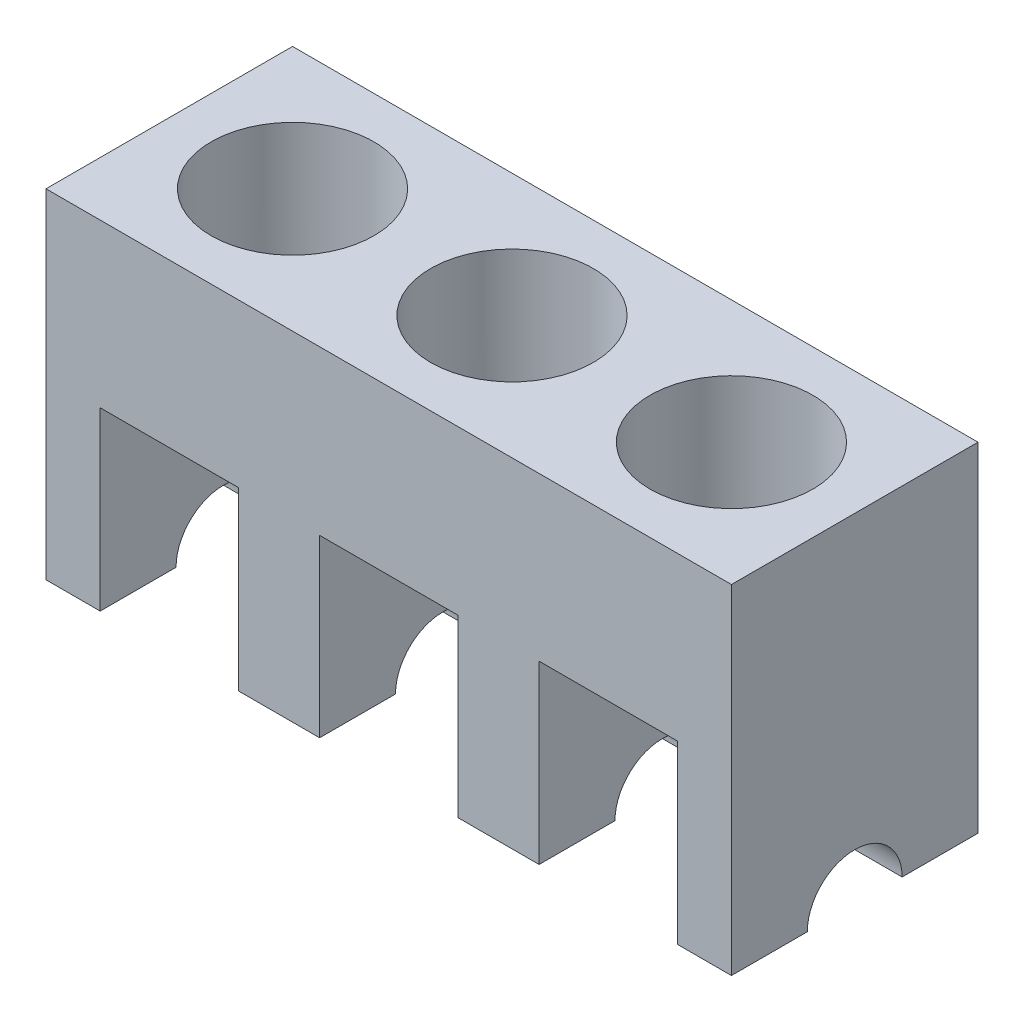
ISO-10303-21;
HEADER;
FILE_DESCRIPTION(('STEP AP214'),'2;1');
FILE_NAME('part.step','',(''),(''),'','','');
FILE_SCHEMA(('AUTOMOTIVE_DESIGN { 1 0 10303 214 1 1 1 1 }'));
ENDSEC;
DATA;
#1=APPLICATION_CONTEXT('core data for automotive mechanical design processes');
#2=APPLICATION_PROTOCOL_DEFINITION('international standard','automotive_design',2000,#1);
#3=PRODUCT_CONTEXT('',#1,'mechanical');
#4=PRODUCT('Part','Part','',(#3));
#5=PRODUCT_RELATED_PRODUCT_CATEGORY('part','',(#4));
#6=PRODUCT_DEFINITION_FORMATION('','',#4);
#7=PRODUCT_DEFINITION_CONTEXT('part definition',#1,'design');
#8=PRODUCT_DEFINITION('design','',#6,#7);
#9=PRODUCT_DEFINITION_SHAPE('','',#8);
#10=(LENGTH_UNIT() NAMED_UNIT(*) SI_UNIT(.MILLI.,.METRE.));
#11=(NAMED_UNIT(*) PLANE_ANGLE_UNIT() SI_UNIT($,.RADIAN.));
#12=(NAMED_UNIT(*) SI_UNIT($,.STERADIAN.) SOLID_ANGLE_UNIT());
#13=UNCERTAINTY_MEASURE_WITH_UNIT(LENGTH_MEASURE(1.E-05),#10,'distance_accuracy_value','');
#14=(GEOMETRIC_REPRESENTATION_CONTEXT(3) GLOBAL_UNCERTAINTY_ASSIGNED_CONTEXT((#13)) GLOBAL_UNIT_ASSIGNED_CONTEXT((#10,
#11,#12)) REPRESENTATION_CONTEXT('',''));
#15=CARTESIAN_POINT('',(0.,0.,0.));
#16=DIRECTION('',(0.,0.,1.));
#17=DIRECTION('',(1.,0.,0.));
#18=AXIS2_PLACEMENT_3D('',#15,#16,#17);
#19=CARTESIAN_POINT('',(0.,0.,0.));
#20=DIRECTION('',(0.,1.,0.));
#21=DIRECTION('',(0.,0.,1.));
#22=AXIS2_PLACEMENT_3D('',#19,#20,#21);
#23=PLANE('',#22);
#24=DIRECTION('',(0.,0.,1.));
#25=VECTOR('',#24,1.);
#26=CARTESIAN_POINT('',(-2.23538704581357,0.,-89.9375987361758));
#27=LINE('',#26,#25);
#28=CARTESIAN_POINT('',(-2.23538704581357,0.,-26.9375987361766));
#29=VERTEX_POINT('',#28);
#30=CARTESIAN_POINT('',(-2.23538704581356,0.,1.06240126382305));
#31=VERTEX_POINT('',#30);
#32=EDGE_CURVE('E289',#29,#31,#27,.T.);
#33=ORIENTED_EDGE('',*,*,#32,.F.);
#34=DIRECTION('',(1.,0.,0.));
#35=VECTOR('',#34,1.);
#36=CARTESIAN_POINT('',(-2.23538704581357,0.,-26.9375987361766));
#37=LINE('',#36,#35);
#38=CARTESIAN_POINT('',(17.7646129541862,0.,-26.9375987361766));
#39=VERTEX_POINT('',#38);
#40=EDGE_CURVE('E269',#29,#39,#37,.T.);
#41=ORIENTED_EDGE('',*,*,#40,.T.);
#42=DIRECTION('',(0.,0.,1.));
#43=VECTOR('',#42,1.);
#44=CARTESIAN_POINT('',(17.7646129541862,0.,-89.9375987361758));
#45=LINE('',#44,#43);
#46=CARTESIAN_POINT('',(17.7646129541862,0.,1.06240126382305));
#47=VERTEX_POINT('',#46);
#48=EDGE_CURVE('E554',#39,#47,#45,.T.);
#49=ORIENTED_EDGE('',*,*,#48,.T.);
#50=DIRECTION('',(1.,0.,0.));
#51=VECTOR('',#50,1.);
#52=CARTESIAN_POINT('',(-2.23538704581356,0.,1.06240126382305));
#53=LINE('',#52,#51);
#54=EDGE_CURVE('E293',#31,#47,#53,.T.);
#55=ORIENTED_EDGE('',*,*,#54,.F.);
#56=EDGE_LOOP('',(#33,#41,#49,#55));
#57=FACE_BOUND('',#56,.T.);
#58=ADVANCED_FACE('F35',(#57),#23,.F.);
#59=DIRECTION('',(0.,0.,1.));
#60=VECTOR('',#59,1.);
#61=CARTESIAN_POINT('',(68.7646129541856,0.,-89.9375987361758));
#62=LINE('',#61,#60);
#63=CARTESIAN_POINT('',(68.7646129541856,0.,-26.9375987361766));
#64=VERTEX_POINT('',#63);
#65=CARTESIAN_POINT('',(68.7646129541856,0.,1.06240126382305));
#66=VERTEX_POINT('',#65);
#67=EDGE_CURVE('E540',#64,#66,#62,.T.);
#68=ORIENTED_EDGE('',*,*,#67,.F.);
#69=DIRECTION('',(1.,0.,0.));
#70=VECTOR('',#69,1.);
#71=CARTESIAN_POINT('',(-2.23538704581357,0.,-26.9375987361766));
#72=LINE('',#71,#70);
#73=CARTESIAN_POINT('',(98.7646129541852,0.,-26.9375987361766));
#74=VERTEX_POINT('',#73);
#75=EDGE_CURVE('E542',#64,#74,#72,.T.);
#76=ORIENTED_EDGE('',*,*,#75,.T.);
#77=DIRECTION('',(0.,0.,1.));
#78=VECTOR('',#77,1.);
#79=CARTESIAN_POINT('',(98.7646129541852,0.,0.));
#80=LINE('',#79,#78);
#81=CARTESIAN_POINT('',(98.7646129541852,0.,1.06240126382305));
#82=VERTEX_POINT('',#81);
#83=EDGE_CURVE('E414',#74,#82,#80,.T.);
#84=ORIENTED_EDGE('',*,*,#83,.T.);
#85=EDGE_CURVE('E300',#66,#82,#53,.T.);
#86=ORIENTED_EDGE('',*,*,#85,.F.);
#87=EDGE_LOOP('',(#68,#76,#84,#86));
#88=FACE_BOUND('',#87,.T.);
#89=ADVANCED_FACE('F538',(#88),#23,.F.);
#90=DIRECTION('',(0.,0.,-1.));
#91=VECTOR('',#90,1.);
#92=CARTESIAN_POINT('',(149.764612954185,0.,0.));
#93=LINE('',#92,#91);
#94=CARTESIAN_POINT('',(149.764612954185,0.,1.06240126382305));
#95=VERTEX_POINT('',#94);
#96=CARTESIAN_POINT('',(149.764612954185,0.,-26.9375987361766));
#97=VERTEX_POINT('',#96);
#98=EDGE_CURVE('E405',#95,#97,#93,.T.);
#99=ORIENTED_EDGE('',*,*,#98,.T.);
#100=DIRECTION('',(1.,0.,0.));
#101=VECTOR('',#100,1.);
#102=CARTESIAN_POINT('',(-2.23538704581357,0.,-26.9375987361766));
#103=LINE('',#102,#101);
#104=CARTESIAN_POINT('',(179.764612954184,0.,-26.9375987361766));
#105=VERTEX_POINT('',#104);
#106=EDGE_CURVE('E520',#97,#105,#103,.T.);
#107=ORIENTED_EDGE('',*,*,#106,.T.);
#108=DIRECTION('',(0.,0.,1.));
#109=VECTOR('',#108,1.);
#110=CARTESIAN_POINT('',(179.764612954184,0.,-89.9375987361758));
#111=LINE('',#110,#109);
#112=CARTESIAN_POINT('',(179.764612954184,0.,1.06240126382305));
#113=VERTEX_POINT('',#112);
#114=EDGE_CURVE('E384',#105,#113,#111,.T.);
#115=ORIENTED_EDGE('',*,*,#114,.T.);
#116=EDGE_CURVE('E291',#95,#113,#53,.T.);
#117=ORIENTED_EDGE('',*,*,#116,.F.);
#118=EDGE_LOOP('',(#99,#107,#115,#117));
#119=FACE_BOUND('',#118,.T.);
#120=ADVANCED_FACE('F518',(#119),#23,.F.);
#121=DIRECTION('',(0.,0.,1.));
#122=VECTOR('',#121,1.);
#123=CARTESIAN_POINT('',(230.764612954184,0.,-89.9375987361758));
#124=LINE('',#123,#122);
#125=CARTESIAN_POINT('',(230.764612954184,0.,-26.9375987361766));
#126=VERTEX_POINT('',#125);
#127=CARTESIAN_POINT('',(230.764612954184,0.,1.06240126382305));
#128=VERTEX_POINT('',#127);
#129=EDGE_CURVE('E380',#126,#128,#124,.T.);
#130=ORIENTED_EDGE('',*,*,#129,.F.);
#131=DIRECTION('',(1.,0.,0.));
#132=VECTOR('',#131,1.);
#133=CARTESIAN_POINT('',(-2.23538704581357,0.,-26.9375987361766));
#134=LINE('',#133,#132);
#135=CARTESIAN_POINT('',(250.764612954183,0.,-26.9375987361766));
#136=VERTEX_POINT('',#135);
#137=EDGE_CURVE('E594',#126,#136,#134,.T.);
#138=ORIENTED_EDGE('',*,*,#137,.T.);
#139=DIRECTION('',(0.,0.,-1.));
#140=VECTOR('',#139,1.);
#141=CARTESIAN_POINT('',(250.764612954183,0.,1.06240126382305));
#142=LINE('',#141,#140);
#143=CARTESIAN_POINT('',(250.764612954183,0.,1.06240126382305));
#144=VERTEX_POINT('',#143);
#145=EDGE_CURVE('E301',#144,#136,#142,.T.);
#146=ORIENTED_EDGE('',*,*,#145,.F.);
#147=EDGE_CURVE('E288',#128,#144,#53,.T.);
#148=ORIENTED_EDGE('',*,*,#147,.F.);
#149=EDGE_LOOP('',(#130,#138,#146,#148));
#150=FACE_BOUND('',#149,.T.);
#151=ADVANCED_FACE('F646',(#150),#23,.F.);
#152=CARTESIAN_POINT('',(17.7646129541862,0.,-89.9375987361758));
#153=VERTEX_POINT('',#152);
#154=CARTESIAN_POINT('',(17.7646129541862,0.,-61.9375987361762));
#155=VERTEX_POINT('',#154);
#156=EDGE_CURVE('E282',#153,#155,#45,.T.);
#157=ORIENTED_EDGE('',*,*,#156,.T.);
#158=DIRECTION('',(1.,0.,0.));
#159=VECTOR('',#158,1.);
#160=CARTESIAN_POINT('',(-2.23538704581357,0.,-61.9375987361762));
#161=LINE('',#160,#159);
#162=CARTESIAN_POINT('',(-2.23538704581357,0.,-61.9375987361762));
#163=VERTEX_POINT('',#162);
#164=EDGE_CURVE('E50',#155,#163,#161,.F.);
#165=ORIENTED_EDGE('',*,*,#164,.T.);
#166=CARTESIAN_POINT('',(-2.23538704581357,0.,-89.9375987361758));
#167=VERTEX_POINT('',#166);
#168=EDGE_CURVE('E280',#167,#163,#27,.T.);
#169=ORIENTED_EDGE('',*,*,#168,.F.);
#170=DIRECTION('',(-1.,0.,0.));
#171=VECTOR('',#170,1.);
#172=CARTESIAN_POINT('',(250.764612954183,0.,-89.9375987361758));
#173=LINE('',#172,#171);
#174=EDGE_CURVE('E433',#153,#167,#173,.T.);
#175=ORIENTED_EDGE('',*,*,#174,.F.);
#176=EDGE_LOOP('',(#157,#165,#169,#175));
#177=FACE_BOUND('',#176,.T.);
#178=ADVANCED_FACE('F278',(#177),#23,.F.);
#179=CARTESIAN_POINT('',(98.7646129541852,0.,-89.9375987361758));
#180=VERTEX_POINT('',#179);
#181=CARTESIAN_POINT('',(98.7646129541852,0.,-61.9375987361762));
#182=VERTEX_POINT('',#181);
#183=EDGE_CURVE('E415',#180,#182,#80,.T.);
#184=ORIENTED_EDGE('',*,*,#183,.T.);
#185=DIRECTION('',(1.,0.,0.));
#186=VECTOR('',#185,1.);
#187=CARTESIAN_POINT('',(-2.23538704581357,0.,-61.9375987361762));
#188=LINE('',#187,#186);
#189=CARTESIAN_POINT('',(68.7646129541856,0.,-61.9375987361762));
#190=VERTEX_POINT('',#189);
#191=EDGE_CURVE('E58',#182,#190,#188,.F.);
#192=ORIENTED_EDGE('',*,*,#191,.T.);
#193=CARTESIAN_POINT('',(68.7646129541856,0.,-89.9375987361758));
#194=VERTEX_POINT('',#193);
#195=EDGE_CURVE('E555',#194,#190,#62,.T.);
#196=ORIENTED_EDGE('',*,*,#195,.F.);
#197=EDGE_CURVE('E468',#180,#194,#173,.T.);
#198=ORIENTED_EDGE('',*,*,#197,.F.);
#199=EDGE_LOOP('',(#184,#192,#196,#198));
#200=FACE_BOUND('',#199,.T.);
#201=ADVANCED_FACE('F638',(#200),#23,.F.);
#202=CARTESIAN_POINT('',(179.764612954184,0.,-89.9375987361758));
#203=VERTEX_POINT('',#202);
#204=CARTESIAN_POINT('',(179.764612954184,0.,-61.9375987361762));
#205=VERTEX_POINT('',#204);
#206=EDGE_CURVE('E381',#203,#205,#111,.T.);
#207=ORIENTED_EDGE('',*,*,#206,.T.);
#208=DIRECTION('',(1.,0.,0.));
#209=VECTOR('',#208,1.);
#210=CARTESIAN_POINT('',(-2.23538704581357,0.,-61.9375987361762));
#211=LINE('',#210,#209);
#212=CARTESIAN_POINT('',(149.764612954185,0.,-61.9375987361762));
#213=VERTEX_POINT('',#212);
#214=EDGE_CURVE('E482',#205,#213,#211,.F.);
#215=ORIENTED_EDGE('',*,*,#214,.T.);
#216=CARTESIAN_POINT('',(149.764612954185,0.,-89.9375987361758));
#217=VERTEX_POINT('',#216);
#218=EDGE_CURVE('E404',#213,#217,#93,.T.);
#219=ORIENTED_EDGE('',*,*,#218,.T.);
#220=EDGE_CURVE('E470',#203,#217,#173,.T.);
#221=ORIENTED_EDGE('',*,*,#220,.F.);
#222=EDGE_LOOP('',(#207,#215,#219,#221));
#223=FACE_BOUND('',#222,.T.);
#224=ADVANCED_FACE('F479',(#223),#23,.F.);
#225=CARTESIAN_POINT('',(0.,43.9999999999995,0.));
#226=DIRECTION('',(0.,1.,0.));
#227=DIRECTION('',(0.,0.,1.));
#228=AXIS2_PLACEMENT_3D('',#225,#226,#227);
#229=PLANE('',#228);
#230=DIRECTION('',(0.,0.,1.));
#231=VECTOR('',#230,1.);
#232=CARTESIAN_POINT('',(179.764612954184,43.9999999999995,0.));
#233=LINE('',#232,#231);
#234=CARTESIAN_POINT('',(179.764612954184,43.9999999999995,-60.3357904572494));
#235=VERTEX_POINT('',#234);
#236=CARTESIAN_POINT('',(179.764612954184,43.9999999999995,-28.5394070151034));
#237=VERTEX_POINT('',#236);
#238=EDGE_CURVE('E334',#235,#237,#233,.T.);
#239=ORIENTED_EDGE('',*,*,#238,.F.);
#240=CARTESIAN_POINT('',(205.264612954184,43.9999999999995,-44.4375987361764));
#241=DIRECTION('',(0.,1.,0.));
#242=DIRECTION('',(0.,0.,1.));
#243=AXIS2_PLACEMENT_3D('',#240,#241,#242);
#244=CIRCLE('',#243,30.0499999999996);
#245=EDGE_CURVE('E438',#237,#235,#244,.F.);
#246=ORIENTED_EDGE('',*,*,#245,.F.);
#247=EDGE_LOOP('',(#239,#246));
#248=FACE_BOUND('',#247,.T.);
#249=ADVANCED_FACE('F612',(#248),#229,.T.);
#250=CARTESIAN_POINT('',(0.,43.9999999999995,0.));
#251=DIRECTION('',(0.,1.,0.));
#252=DIRECTION('',(0.,0.,1.));
#253=AXIS2_PLACEMENT_3D('',#250,#251,#252);
#254=PLANE('',#253);
#255=DIRECTION('',(0.,0.,1.));
#256=VECTOR('',#255,1.);
#257=CARTESIAN_POINT('',(98.7646129541852,43.9999999999995,0.));
#258=LINE('',#257,#256);
#259=CARTESIAN_POINT('',(98.7646129541852,43.9999999999995,-60.3357904572494));
#260=VERTEX_POINT('',#259);
#261=CARTESIAN_POINT('',(98.7646129541852,43.9999999999995,-28.5394070151033));
#262=VERTEX_POINT('',#261);
#263=EDGE_CURVE('E326',#260,#262,#258,.T.);
#264=ORIENTED_EDGE('',*,*,#263,.F.);
#265=CARTESIAN_POINT('',(124.264612954185,43.9999999999995,-44.4375987361764));
#266=DIRECTION('',(0.,1.,0.));
#267=DIRECTION('',(0.,0.,1.));
#268=AXIS2_PLACEMENT_3D('',#265,#266,#267);
#269=CIRCLE('',#268,30.0499999999996);
#270=EDGE_CURVE('E429',#262,#260,#269,.F.);
#271=ORIENTED_EDGE('',*,*,#270,.F.);
#272=EDGE_LOOP('',(#264,#271));
#273=FACE_BOUND('',#272,.T.);
#274=ADVANCED_FACE('F622',(#273),#254,.T.);
#275=CARTESIAN_POINT('',(0.,43.9999999999995,0.));
#276=DIRECTION('',(0.,1.,0.));
#277=DIRECTION('',(0.,0.,1.));
#278=AXIS2_PLACEMENT_3D('',#275,#276,#277);
#279=PLANE('',#278);
#280=DIRECTION('',(0.,0.,1.));
#281=VECTOR('',#280,1.);
#282=CARTESIAN_POINT('',(17.7646129541862,43.9999999999995,0.));
#283=LINE('',#282,#281);
#284=CARTESIAN_POINT('',(17.7646129541862,43.9999999999995,-60.3357904572494));
#285=VERTEX_POINT('',#284);
#286=CARTESIAN_POINT('',(17.7646129541862,43.9999999999995,-28.5394070151034));
#287=VERTEX_POINT('',#286);
#288=EDGE_CURVE('E318',#285,#287,#283,.T.);
#289=ORIENTED_EDGE('',*,*,#288,.F.);
#290=CARTESIAN_POINT('',(43.2646129541859,43.9999999999995,-44.4375987361764));
#291=DIRECTION('',(0.,1.,0.));
#292=DIRECTION('',(0.,0.,1.));
#293=AXIS2_PLACEMENT_3D('',#290,#291,#292);
#294=CIRCLE('',#293,30.0499999999996);
#295=EDGE_CURVE('E430',#287,#285,#294,.F.);
#296=ORIENTED_EDGE('',*,*,#295,.F.);
#297=EDGE_LOOP('',(#289,#296));
#298=FACE_BOUND('',#297,.T.);
#299=ADVANCED_FACE('F658',(#298),#279,.T.);
#300=CARTESIAN_POINT('',(250.764612954183,124.999999999998,-89.9375987361758));
#301=DIRECTION('',(0.,0.,1.));
#302=DIRECTION('',(1.,0.,0.));
#303=AXIS2_PLACEMENT_3D('',#300,#301,#302);
#304=PLANE('',#303);
#305=DIRECTION('',(-1.,0.,0.));
#306=VECTOR('',#305,1.);
#307=CARTESIAN_POINT('',(17.7646129541862,64.9999999999992,-89.9375987361758));
#308=LINE('',#307,#306);
#309=CARTESIAN_POINT('',(68.7646129541856,64.9999999999992,-89.9375987361758));
#310=VERTEX_POINT('',#309);
#311=CARTESIAN_POINT('',(17.7646129541862,64.9999999999992,-89.9375987361758));
#312=VERTEX_POINT('',#311);
#313=EDGE_CURVE('E565',#310,#312,#308,.T.);
#314=ORIENTED_EDGE('',*,*,#313,.T.);
#315=DIRECTION('',(0.,-1.,0.));
#316=VECTOR('',#315,1.);
#317=CARTESIAN_POINT('',(17.7646129541862,0.,-89.9375987361758));
#318=LINE('',#317,#316);
#319=EDGE_CURVE('E467',#312,#153,#318,.T.);
#320=ORIENTED_EDGE('',*,*,#319,.T.);
#321=ORIENTED_EDGE('',*,*,#174,.T.);
#322=DIRECTION('',(0.,-1.,0.));
#323=VECTOR('',#322,1.);
#324=CARTESIAN_POINT('',(-2.23538704581357,124.999999999998,-89.9375987361758));
#325=LINE('',#324,#323);
#326=CARTESIAN_POINT('',(-2.23538704581357,124.999999999998,-89.9375987361758));
#327=VERTEX_POINT('',#326);
#328=EDGE_CURVE('E287',#327,#167,#325,.T.);
#329=ORIENTED_EDGE('',*,*,#328,.F.);
#330=DIRECTION('',(-1.,0.,0.));
#331=VECTOR('',#330,1.);
#332=CARTESIAN_POINT('',(250.764612954183,124.999999999998,-89.9375987361758));
#333=LINE('',#332,#331);
#334=CARTESIAN_POINT('',(250.764612954183,124.999999999998,-89.9375987361758));
#335=VERTEX_POINT('',#334);
#336=EDGE_CURVE('E304',#335,#327,#333,.T.);
#337=ORIENTED_EDGE('',*,*,#336,.F.);
#338=DIRECTION('',(0.,-1.,0.));
#339=VECTOR('',#338,1.);
#340=CARTESIAN_POINT('',(250.764612954183,124.999999999998,-89.9375987361758));
#341=LINE('',#340,#339);
#342=CARTESIAN_POINT('',(250.764612954183,0.,-89.9375987361758));
#343=VERTEX_POINT('',#342);
#344=EDGE_CURVE('E305',#335,#343,#341,.T.);
#345=ORIENTED_EDGE('',*,*,#344,.T.);
#346=CARTESIAN_POINT('',(230.764612954184,0.,-89.9375987361758));
#347=VERTEX_POINT('',#346);
#348=EDGE_CURVE('E294',#343,#347,#173,.T.);
#349=ORIENTED_EDGE('',*,*,#348,.T.);
#350=DIRECTION('',(0.,1.,0.));
#351=VECTOR('',#350,1.);
#352=CARTESIAN_POINT('',(230.764612954184,0.,-89.9375987361758));
#353=LINE('',#352,#351);
#354=CARTESIAN_POINT('',(230.764612954184,64.9999999999992,-89.9375987361758));
#355=VERTEX_POINT('',#354);
#356=EDGE_CURVE('E514',#347,#355,#353,.T.);
#357=ORIENTED_EDGE('',*,*,#356,.T.);
#358=DIRECTION('',(-1.,0.,0.));
#359=VECTOR('',#358,1.);
#360=CARTESIAN_POINT('',(179.764612954184,64.9999999999992,-89.9375987361758));
#361=LINE('',#360,#359);
#362=CARTESIAN_POINT('',(179.764612954184,64.9999999999992,-89.9375987361758));
#363=VERTEX_POINT('',#362);
#364=EDGE_CURVE('E373',#355,#363,#361,.T.);
#365=ORIENTED_EDGE('',*,*,#364,.T.);
#366=DIRECTION('',(0.,-1.,0.));
#367=VECTOR('',#366,1.);
#368=CARTESIAN_POINT('',(179.764612954184,0.,-89.9375987361758));
#369=LINE('',#368,#367);
#370=EDGE_CURVE('E363',#363,#203,#369,.T.);
#371=ORIENTED_EDGE('',*,*,#370,.T.);
#372=ORIENTED_EDGE('',*,*,#220,.T.);
#373=DIRECTION('',(0.,1.,0.));
#374=VECTOR('',#373,1.);
#375=CARTESIAN_POINT('',(149.764612954185,-0.281822110348069,-89.9375987361758));
#376=LINE('',#375,#374);
#377=CARTESIAN_POINT('',(149.764612954185,64.7181778896511,-89.9375987361758));
#378=VERTEX_POINT('',#377);
#379=EDGE_CURVE('E477',#217,#378,#376,.T.);
#380=ORIENTED_EDGE('',*,*,#379,.T.);
#381=DIRECTION('',(-1.,0.,0.));
#382=VECTOR('',#381,1.);
#383=CARTESIAN_POINT('',(98.7646129541852,64.7181778896511,-89.9375987361758));
#384=LINE('',#383,#382);
#385=CARTESIAN_POINT('',(98.7646129541852,64.7181778896511,-89.9375987361758));
#386=VERTEX_POINT('',#385);
#387=EDGE_CURVE('E489',#378,#386,#384,.T.);
#388=ORIENTED_EDGE('',*,*,#387,.T.);
#389=DIRECTION('',(0.,-1.,0.));
#390=VECTOR('',#389,1.);
#391=CARTESIAN_POINT('',(98.7646129541852,-0.281822110348069,-89.9375987361758));
#392=LINE('',#391,#390);
#393=EDGE_CURVE('E490',#386,#180,#392,.T.);
#394=ORIENTED_EDGE('',*,*,#393,.T.);
#395=ORIENTED_EDGE('',*,*,#197,.T.);
#396=DIRECTION('',(0.,1.,0.));
#397=VECTOR('',#396,1.);
#398=CARTESIAN_POINT('',(68.7646129541856,0.,-89.9375987361758));
#399=LINE('',#398,#397);
#400=EDGE_CURVE('E567',#194,#310,#399,.T.);
#401=ORIENTED_EDGE('',*,*,#400,.T.);
#402=EDGE_LOOP('',(#314,#320,#321,#329,#337,#345,#349,#357,#365,#371,#372,#380,#388,#394,#395,#401));
#403=FACE_BOUND('',#402,.T.);
#404=ADVANCED_FACE('F37',(#403),#304,.F.);
#405=CARTESIAN_POINT('',(-2.23538704581357,124.999999999998,-89.9375987361758));
#406=DIRECTION('',(1.,0.,0.));
#407=DIRECTION('',(0.,0.,-1.));
#408=AXIS2_PLACEMENT_3D('',#405,#406,#407);
#409=PLANE('',#408);
#410=ORIENTED_EDGE('',*,*,#168,.T.);
#411=CARTESIAN_POINT('',(-2.23538704581357,0.,-44.4375987361764));
#412=DIRECTION('',(1.,0.,0.));
#413=DIRECTION('',(0.,0.,-1.));
#414=AXIS2_PLACEMENT_3D('',#411,#412,#413);
#415=CIRCLE('',#414,17.4999999999998);
#416=EDGE_CURVE('E266',#163,#29,#415,.T.);
#417=ORIENTED_EDGE('',*,*,#416,.T.);
#418=ORIENTED_EDGE('',*,*,#32,.T.);
#419=DIRECTION('',(0.,-1.,0.));
#420=VECTOR('',#419,1.);
#421=CARTESIAN_POINT('',(-2.23538704581356,124.999999999998,1.06240126382305));
#422=LINE('',#421,#420);
#423=CARTESIAN_POINT('',(-2.23538704581356,124.999999999998,1.06240126382305));
#424=VERTEX_POINT('',#423);
#425=EDGE_CURVE('E312',#424,#31,#422,.T.);
#426=ORIENTED_EDGE('',*,*,#425,.F.);
#427=DIRECTION('',(0.,0.,1.));
#428=VECTOR('',#427,1.);
#429=CARTESIAN_POINT('',(-2.23538704581357,124.999999999998,-89.9375987361758));
#430=LINE('',#429,#428);
#431=EDGE_CURVE('E447',#327,#424,#430,.T.);
#432=ORIENTED_EDGE('',*,*,#431,.F.);
#433=ORIENTED_EDGE('',*,*,#328,.T.);
#434=EDGE_LOOP('',(#410,#417,#418,#426,#432,#433));
#435=FACE_BOUND('',#434,.T.);
#436=ADVANCED_FACE('F285',(#435),#409,.F.);
#437=CARTESIAN_POINT('',(-2.23538704581356,124.999999999998,1.06240126382305));
#438=DIRECTION('',(0.,0.,-1.));
#439=DIRECTION('',(-1.,0.,0.));
#440=AXIS2_PLACEMENT_3D('',#437,#438,#439);
#441=PLANE('',#440);
#442=ORIENTED_EDGE('',*,*,#54,.T.);
#443=DIRECTION('',(0.,-1.,0.));
#444=VECTOR('',#443,1.);
#445=CARTESIAN_POINT('',(17.7646129541862,0.,1.06240126382305));
#446=LINE('',#445,#444);
#447=CARTESIAN_POINT('',(17.7646129541862,64.9999999999992,1.06240126382305));
#448=VERTEX_POINT('',#447);
#449=EDGE_CURVE('E502',#448,#47,#446,.T.);
#450=ORIENTED_EDGE('',*,*,#449,.F.);
#451=DIRECTION('',(-1.,0.,0.));
#452=VECTOR('',#451,1.);
#453=CARTESIAN_POINT('',(17.7646129541862,64.9999999999992,1.06240126382305));
#454=LINE('',#453,#452);
#455=CARTESIAN_POINT('',(68.7646129541856,64.9999999999992,1.06240126382305));
#456=VERTEX_POINT('',#455);
#457=EDGE_CURVE('E571',#456,#448,#454,.T.);
#458=ORIENTED_EDGE('',*,*,#457,.F.);
#459=DIRECTION('',(0.,1.,0.));
#460=VECTOR('',#459,1.);
#461=CARTESIAN_POINT('',(68.7646129541856,0.,1.06240126382305));
#462=LINE('',#461,#460);
#463=EDGE_CURVE('E535',#66,#456,#462,.T.);
#464=ORIENTED_EDGE('',*,*,#463,.F.);
#465=ORIENTED_EDGE('',*,*,#85,.T.);
#466=DIRECTION('',(0.,-1.,0.));
#467=VECTOR('',#466,1.);
#468=CARTESIAN_POINT('',(98.7646129541852,-0.281822110348069,1.06240126382305));
#469=LINE('',#468,#467);
#470=CARTESIAN_POINT('',(98.7646129541852,64.7181778896511,1.06240126382305));
#471=VERTEX_POINT('',#470);
#472=EDGE_CURVE('E365',#471,#82,#469,.T.);
#473=ORIENTED_EDGE('',*,*,#472,.F.);
#474=DIRECTION('',(-1.,0.,0.));
#475=VECTOR('',#474,1.);
#476=CARTESIAN_POINT('',(98.7646129541852,64.7181778896511,1.06240126382305));
#477=LINE('',#476,#475);
#478=CARTESIAN_POINT('',(149.764612954185,64.7181778896511,1.06240126382305));
#479=VERTEX_POINT('',#478);
#480=EDGE_CURVE('E495',#479,#471,#477,.T.);
#481=ORIENTED_EDGE('',*,*,#480,.F.);
#482=DIRECTION('',(0.,1.,0.));
#483=VECTOR('',#482,1.);
#484=CARTESIAN_POINT('',(149.764612954185,-0.281822110348069,1.06240126382305));
#485=LINE('',#484,#483);
#486=EDGE_CURVE('E369',#95,#479,#485,.T.);
#487=ORIENTED_EDGE('',*,*,#486,.F.);
#488=ORIENTED_EDGE('',*,*,#116,.T.);
#489=DIRECTION('',(0.,-1.,0.));
#490=VECTOR('',#489,1.);
#491=CARTESIAN_POINT('',(179.764612954184,0.,1.06240126382305));
#492=LINE('',#491,#490);
#493=CARTESIAN_POINT('',(179.764612954184,64.9999999999992,1.06240126382305));
#494=VERTEX_POINT('',#493);
#495=EDGE_CURVE('E505',#494,#113,#492,.T.);
#496=ORIENTED_EDGE('',*,*,#495,.F.);
#497=DIRECTION('',(-1.,0.,0.));
#498=VECTOR('',#497,1.);
#499=CARTESIAN_POINT('',(179.764612954184,64.9999999999992,1.06240126382305));
#500=LINE('',#499,#498);
#501=CARTESIAN_POINT('',(230.764612954184,64.9999999999992,1.06240126382305));
#502=VERTEX_POINT('',#501);
#503=EDGE_CURVE('E511',#502,#494,#500,.T.);
#504=ORIENTED_EDGE('',*,*,#503,.F.);
#505=DIRECTION('',(0.,1.,0.));
#506=VECTOR('',#505,1.);
#507=CARTESIAN_POINT('',(230.764612954184,0.,1.06240126382305));
#508=LINE('',#507,#506);
#509=EDGE_CURVE('E508',#128,#502,#508,.T.);
#510=ORIENTED_EDGE('',*,*,#509,.F.);
#511=ORIENTED_EDGE('',*,*,#147,.T.);
#512=DIRECTION('',(0.,-1.,0.));
#513=VECTOR('',#512,1.);
#514=CARTESIAN_POINT('',(250.764612954183,124.999999999998,1.06240126382305));
#515=LINE('',#514,#513);
#516=CARTESIAN_POINT('',(250.764612954183,124.999999999998,1.06240126382305));
#517=VERTEX_POINT('',#516);
#518=EDGE_CURVE('E308',#517,#144,#515,.T.);
#519=ORIENTED_EDGE('',*,*,#518,.F.);
#520=DIRECTION('',(1.,0.,0.));
#521=VECTOR('',#520,1.);
#522=CARTESIAN_POINT('',(-2.23538704581356,124.999999999998,1.06240126382305));
#523=LINE('',#522,#521);
#524=EDGE_CURVE('E449',#424,#517,#523,.T.);
#525=ORIENTED_EDGE('',*,*,#524,.F.);
#526=ORIENTED_EDGE('',*,*,#425,.T.);
#527=EDGE_LOOP('',(#442,#450,#458,#464,#465,#473,#481,#487,#488,#496,#504,#510,#511,#519,#525,#526));
#528=FACE_BOUND('',#527,.T.);
#529=ADVANCED_FACE('F527',(#528),#441,.F.);
#530=CARTESIAN_POINT('',(250.764612954183,124.999999999998,1.06240126382305));
#531=DIRECTION('',(-1.,0.,0.));
#532=DIRECTION('',(0.,0.,1.));
#533=AXIS2_PLACEMENT_3D('',#530,#531,#532);
#534=PLANE('',#533);
#535=ORIENTED_EDGE('',*,*,#145,.T.);
#536=CARTESIAN_POINT('',(250.764612954183,0.,-44.4375987361764));
#537=DIRECTION('',(-1.,0.,0.));
#538=DIRECTION('',(0.,0.,1.));
#539=AXIS2_PLACEMENT_3D('',#536,#537,#538);
#540=CIRCLE('',#539,17.4999999999998);
#541=CARTESIAN_POINT('',(250.764612954183,0.,-61.9375987361762));
#542=VERTEX_POINT('',#541);
#543=EDGE_CURVE('E592',#136,#542,#540,.T.);
#544=ORIENTED_EDGE('',*,*,#543,.T.);
#545=EDGE_CURVE('E299',#542,#343,#142,.T.);
#546=ORIENTED_EDGE('',*,*,#545,.T.);
#547=ORIENTED_EDGE('',*,*,#344,.F.);
#548=DIRECTION('',(0.,0.,-1.));
#549=VECTOR('',#548,1.);
#550=CARTESIAN_POINT('',(250.764612954183,124.999999999998,1.06240126382305));
#551=LINE('',#550,#549);
#552=EDGE_CURVE('E309',#517,#335,#551,.T.);
#553=ORIENTED_EDGE('',*,*,#552,.F.);
#554=ORIENTED_EDGE('',*,*,#518,.T.);
#555=EDGE_LOOP('',(#535,#544,#546,#547,#553,#554));
#556=FACE_BOUND('',#555,.T.);
#557=ADVANCED_FACE('F458',(#556),#534,.F.);
#558=CARTESIAN_POINT('',(0.,124.999999999998,0.));
#559=DIRECTION('',(0.,1.,0.));
#560=DIRECTION('',(0.,0.,1.));
#561=AXIS2_PLACEMENT_3D('',#558,#559,#560);
#562=PLANE('',#561);
#563=CARTESIAN_POINT('',(43.2646129541859,124.999999999998,-44.4375987361764));
#564=DIRECTION('',(0.,1.,0.));
#565=DIRECTION('',(0.,0.,1.));
#566=AXIS2_PLACEMENT_3D('',#563,#564,#565);
#567=CIRCLE('',#566,30.0499999999996);
#568=CARTESIAN_POINT('',(43.2646129541859,124.999999999998,-14.3875987361768));
#569=VERTEX_POINT('',#568);
#570=EDGE_CURVE('E425',#569,#569,#567,.T.);
#571=ORIENTED_EDGE('',*,*,#570,.F.);
#572=EDGE_LOOP('',(#571));
#573=FACE_BOUND('',#572,.T.);
#574=CARTESIAN_POINT('',(124.264612954185,124.999999999998,-44.4375987361764));
#575=DIRECTION('',(0.,1.,0.));
#576=DIRECTION('',(0.,0.,1.));
#577=AXIS2_PLACEMENT_3D('',#574,#575,#576);
#578=CIRCLE('',#577,30.0499999999996);
#579=CARTESIAN_POINT('',(124.264612954185,124.999999999998,-14.3875987361768));
#580=VERTEX_POINT('',#579);
#581=EDGE_CURVE('E434',#580,#580,#578,.T.);
#582=ORIENTED_EDGE('',*,*,#581,.F.);
#583=EDGE_LOOP('',(#582));
#584=FACE_BOUND('',#583,.T.);
#585=CARTESIAN_POINT('',(205.264612954184,124.999999999998,-44.4375987361764));
#586=DIRECTION('',(0.,1.,0.));
#587=DIRECTION('',(0.,0.,1.));
#588=AXIS2_PLACEMENT_3D('',#585,#586,#587);
#589=CIRCLE('',#588,30.0499999999996);
#590=CARTESIAN_POINT('',(205.264612954184,124.999999999998,-14.3875987361768));
#591=VERTEX_POINT('',#590);
#592=EDGE_CURVE('E424',#591,#591,#589,.T.);
#593=ORIENTED_EDGE('',*,*,#592,.F.);
#594=EDGE_LOOP('',(#593));
#595=FACE_BOUND('',#594,.T.);
#596=ORIENTED_EDGE('',*,*,#336,.T.);
#597=ORIENTED_EDGE('',*,*,#431,.T.);
#598=ORIENTED_EDGE('',*,*,#524,.T.);
#599=ORIENTED_EDGE('',*,*,#552,.T.);
#600=EDGE_LOOP('',(#596,#597,#598,#599));
#601=FACE_BOUND('',#600,.T.);
#602=ADVANCED_FACE('F453',(#573,#584,#595,#601),#562,.T.);
#603=ORIENTED_EDGE('',*,*,#545,.F.);
#604=DIRECTION('',(1.,0.,0.));
#605=VECTOR('',#604,1.);
#606=CARTESIAN_POINT('',(-2.23538704581357,0.,-61.9375987361762));
#607=LINE('',#606,#605);
#608=CARTESIAN_POINT('',(230.764612954184,0.,-61.9375987361762));
#609=VERTEX_POINT('',#608);
#610=EDGE_CURVE('E273',#542,#609,#607,.F.);
#611=ORIENTED_EDGE('',*,*,#610,.T.);
#612=EDGE_CURVE('E377',#347,#609,#124,.T.);
#613=ORIENTED_EDGE('',*,*,#612,.F.);
#614=ORIENTED_EDGE('',*,*,#348,.F.);
#615=EDGE_LOOP('',(#603,#611,#613,#614));
#616=FACE_BOUND('',#615,.T.);
#617=ADVANCED_FACE('F600',(#616),#23,.F.);
#618=CARTESIAN_POINT('',(205.264612954184,-121.994235098622,-44.4375987361764));
#619=DIRECTION('',(0.,1.,0.));
#620=DIRECTION('',(0.,0.,1.));
#621=AXIS2_PLACEMENT_3D('',#618,#619,#620);
#622=CYLINDRICAL_SURFACE('',#621,30.0499999999996);
#623=ORIENTED_EDGE('',*,*,#245,.T.);
#624=DIRECTION('',(0.,1.,0.));
#625=VECTOR('',#624,1.);
#626=CARTESIAN_POINT('',(179.764612954184,-121.994235098622,-60.3357904572494));
#627=LINE('',#626,#625);
#628=CARTESIAN_POINT('',(179.764612954184,64.9999999999992,-60.3357904572494));
#629=VERTEX_POINT('',#628);
#630=EDGE_CURVE('E349',#235,#629,#627,.T.);
#631=ORIENTED_EDGE('',*,*,#630,.T.);
#632=CARTESIAN_POINT('',(205.264612954184,64.9999999999992,-44.4375987361764));
#633=DIRECTION('',(0.,1.,0.));
#634=DIRECTION('',(0.,0.,1.));
#635=AXIS2_PLACEMENT_3D('',#632,#633,#634);
#636=CIRCLE('',#635,30.0499999999996);
#637=CARTESIAN_POINT('',(230.764612954184,64.9999999999992,-60.3357904572493));
#638=VERTEX_POINT('',#637);
#639=EDGE_CURVE('E43',#629,#638,#636,.F.);
#640=ORIENTED_EDGE('',*,*,#639,.T.);
#641=DIRECTION('',(0.,1.,0.));
#642=VECTOR('',#641,1.);
#643=CARTESIAN_POINT('',(230.764612954184,-121.994235098622,-60.3357904572493));
#644=LINE('',#643,#642);
#645=CARTESIAN_POINT('',(230.764612954184,43.9999999999995,-60.3357904572493));
#646=VERTEX_POINT('',#645);
#647=EDGE_CURVE('E347',#638,#646,#644,.F.);
#648=ORIENTED_EDGE('',*,*,#647,.T.);
#649=CARTESIAN_POINT('',(230.764612954184,43.9999999999995,-28.5394070151035));
#650=VERTEX_POINT('',#649);
#651=EDGE_CURVE('E443',#646,#650,#244,.F.);
#652=ORIENTED_EDGE('',*,*,#651,.T.);
#653=DIRECTION('',(0.,1.,0.));
#654=VECTOR('',#653,1.);
#655=CARTESIAN_POINT('',(230.764612954184,-121.994235098622,-28.5394070151035));
#656=LINE('',#655,#654);
#657=CARTESIAN_POINT('',(230.764612954184,64.9999999999992,-28.5394070151035));
#658=VERTEX_POINT('',#657);
#659=EDGE_CURVE('E418',#650,#658,#656,.T.);
#660=ORIENTED_EDGE('',*,*,#659,.T.);
#661=CARTESIAN_POINT('',(179.764612954184,64.9999999999992,-28.5394070151034));
#662=VERTEX_POINT('',#661);
#663=EDGE_CURVE('E335',#658,#662,#636,.F.);
#664=ORIENTED_EDGE('',*,*,#663,.T.);
#665=DIRECTION('',(0.,1.,0.));
#666=VECTOR('',#665,1.);
#667=CARTESIAN_POINT('',(179.764612954184,-121.994235098622,-28.5394070151034));
#668=LINE('',#667,#666);
#669=EDGE_CURVE('E422',#662,#237,#668,.F.);
#670=ORIENTED_EDGE('',*,*,#669,.T.);
#671=EDGE_LOOP('',(#623,#631,#640,#648,#652,#660,#664,#670));
#672=FACE_BOUND('',#671,.T.);
#673=ORIENTED_EDGE('',*,*,#592,.T.);
#674=EDGE_LOOP('',(#673));
#675=FACE_BOUND('',#674,.T.);
#676=ADVANCED_FACE('F344',(#672,#675),#622,.F.);
#677=DIRECTION('',(0.,0.,-1.));
#678=VECTOR('',#677,1.);
#679=CARTESIAN_POINT('',(230.764612954184,43.9999999999995,0.));
#680=LINE('',#679,#678);
#681=EDGE_CURVE('E332',#650,#646,#680,.T.);
#682=ORIENTED_EDGE('',*,*,#681,.F.);
#683=ORIENTED_EDGE('',*,*,#651,.F.);
#684=EDGE_LOOP('',(#682,#683));
#685=FACE_BOUND('',#684,.T.);
#686=ADVANCED_FACE('F608',(#685),#229,.T.);
#687=CARTESIAN_POINT('',(124.264612954185,-121.994235098622,-44.4375987361764));
#688=DIRECTION('',(0.,1.,0.));
#689=DIRECTION('',(0.,0.,1.));
#690=AXIS2_PLACEMENT_3D('',#687,#688,#689);
#691=CYLINDRICAL_SURFACE('',#690,30.0499999999996);
#692=ORIENTED_EDGE('',*,*,#270,.T.);
#693=DIRECTION('',(0.,1.,0.));
#694=VECTOR('',#693,1.);
#695=CARTESIAN_POINT('',(98.7646129541852,-121.994235098622,-60.3357904572494));
#696=LINE('',#695,#694);
#697=CARTESIAN_POINT('',(98.7646129541852,64.7181778896511,-60.3357904572494));
#698=VERTEX_POINT('',#697);
#699=EDGE_CURVE('E408',#260,#698,#696,.T.);
#700=ORIENTED_EDGE('',*,*,#699,.T.);
#701=CARTESIAN_POINT('',(124.264612954185,64.7181778896511,-44.4375987361764));
#702=DIRECTION('',(0.,1.,0.));
#703=DIRECTION('',(0.,0.,1.));
#704=AXIS2_PLACEMENT_3D('',#701,#702,#703);
#705=CIRCLE('',#704,30.0499999999996);
#706=CARTESIAN_POINT('',(149.764612954185,64.7181778896511,-60.3357904572493));
#707=VERTEX_POINT('',#706);
#708=EDGE_CURVE('E331',#698,#707,#705,.F.);
#709=ORIENTED_EDGE('',*,*,#708,.T.);
#710=DIRECTION('',(0.,1.,0.));
#711=VECTOR('',#710,1.);
#712=CARTESIAN_POINT('',(149.764612954185,-121.994235098622,-60.3357904572493));
#713=LINE('',#712,#711);
#714=CARTESIAN_POINT('',(149.764612954185,43.9999999999995,-60.3357904572493));
#715=VERTEX_POINT('',#714);
#716=EDGE_CURVE('E401',#707,#715,#713,.F.);
#717=ORIENTED_EDGE('',*,*,#716,.T.);
#718=CARTESIAN_POINT('',(149.764612954185,43.9999999999995,-28.5394070151034));
#719=VERTEX_POINT('',#718);
#720=EDGE_CURVE('E437',#715,#719,#269,.F.);
#721=ORIENTED_EDGE('',*,*,#720,.T.);
#722=DIRECTION('',(0.,1.,0.));
#723=VECTOR('',#722,1.);
#724=CARTESIAN_POINT('',(149.764612954185,-121.994235098622,-28.5394070151035));
#725=LINE('',#724,#723);
#726=CARTESIAN_POINT('',(149.764612954185,64.7181778896511,-28.5394070151034));
#727=VERTEX_POINT('',#726);
#728=EDGE_CURVE('E398',#719,#727,#725,.T.);
#729=ORIENTED_EDGE('',*,*,#728,.T.);
#730=CARTESIAN_POINT('',(98.7646129541852,64.7181778896511,-28.5394070151033));
#731=VERTEX_POINT('',#730);
#732=EDGE_CURVE('E328',#727,#731,#705,.F.);
#733=ORIENTED_EDGE('',*,*,#732,.T.);
#734=DIRECTION('',(0.,1.,0.));
#735=VECTOR('',#734,1.);
#736=CARTESIAN_POINT('',(98.7646129541852,-121.994235098622,-28.5394070151033));
#737=LINE('',#736,#735);
#738=EDGE_CURVE('E411',#731,#262,#737,.F.);
#739=ORIENTED_EDGE('',*,*,#738,.T.);
#740=EDGE_LOOP('',(#692,#700,#709,#717,#721,#729,#733,#739));
#741=FACE_BOUND('',#740,.T.);
#742=ORIENTED_EDGE('',*,*,#581,.T.);
#743=EDGE_LOOP('',(#742));
#744=FACE_BOUND('',#743,.T.);
#745=ADVANCED_FACE('F610',(#741,#744),#691,.F.);
#746=DIRECTION('',(0.,0.,-1.));
#747=VECTOR('',#746,1.);
#748=CARTESIAN_POINT('',(149.764612954185,43.9999999999995,0.));
#749=LINE('',#748,#747);
#750=EDGE_CURVE('E324',#719,#715,#749,.T.);
#751=ORIENTED_EDGE('',*,*,#750,.F.);
#752=ORIENTED_EDGE('',*,*,#720,.F.);
#753=EDGE_LOOP('',(#751,#752));
#754=FACE_BOUND('',#753,.T.);
#755=ADVANCED_FACE('F617',(#754),#254,.T.);
#756=CARTESIAN_POINT('',(43.2646129541859,-121.994235098622,-44.4375987361764));
#757=DIRECTION('',(0.,1.,0.));
#758=DIRECTION('',(0.,0.,1.));
#759=AXIS2_PLACEMENT_3D('',#756,#757,#758);
#760=CYLINDRICAL_SURFACE('',#759,30.0499999999996);
#761=ORIENTED_EDGE('',*,*,#295,.T.);
#762=DIRECTION('',(0.,1.,0.));
#763=VECTOR('',#762,1.);
#764=CARTESIAN_POINT('',(17.7646129541862,-121.994235098622,-60.3357904572494));
#765=LINE('',#764,#763);
#766=CARTESIAN_POINT('',(17.7646129541862,64.9999999999992,-60.3357904572494));
#767=VERTEX_POINT('',#766);
#768=EDGE_CURVE('E392',#285,#767,#765,.T.);
#769=ORIENTED_EDGE('',*,*,#768,.T.);
#770=CARTESIAN_POINT('',(43.2646129541859,64.9999999999992,-44.4375987361764));
#771=DIRECTION('',(0.,1.,0.));
#772=DIRECTION('',(-1.,0.,0.));
#773=AXIS2_PLACEMENT_3D('',#770,#771,#772);
#774=CIRCLE('',#773,30.0499999999996);
#775=CARTESIAN_POINT('',(68.7646129541856,64.9999999999992,-60.3357904572494));
#776=VERTEX_POINT('',#775);
#777=EDGE_CURVE('E323',#767,#776,#774,.F.);
#778=ORIENTED_EDGE('',*,*,#777,.T.);
#779=DIRECTION('',(0.,1.,0.));
#780=VECTOR('',#779,1.);
#781=CARTESIAN_POINT('',(68.7646129541856,-121.994235098622,-60.3357904572494));
#782=LINE('',#781,#780);
#783=CARTESIAN_POINT('',(68.7646129541856,43.9999999999995,-60.3357904572494));
#784=VERTEX_POINT('',#783);
#785=EDGE_CURVE('E388',#776,#784,#782,.F.);
#786=ORIENTED_EDGE('',*,*,#785,.T.);
#787=CARTESIAN_POINT('',(68.7646129541856,43.9999999999995,-28.5394070151034));
#788=VERTEX_POINT('',#787);
#789=EDGE_CURVE('E428',#784,#788,#294,.F.);
#790=ORIENTED_EDGE('',*,*,#789,.T.);
#791=DIRECTION('',(0.,1.,0.));
#792=VECTOR('',#791,1.);
#793=CARTESIAN_POINT('',(68.7646129541856,-121.994235098622,-28.5394070151034));
#794=LINE('',#793,#792);
#795=CARTESIAN_POINT('',(68.7646129541856,64.9999999999992,-28.5394070151034));
#796=VERTEX_POINT('',#795);
#797=EDGE_CURVE('E385',#788,#796,#794,.T.);
#798=ORIENTED_EDGE('',*,*,#797,.T.);
#799=CARTESIAN_POINT('',(17.7646129541862,64.9999999999992,-28.5394070151034));
#800=VERTEX_POINT('',#799);
#801=EDGE_CURVE('E320',#796,#800,#774,.F.);
#802=ORIENTED_EDGE('',*,*,#801,.T.);
#803=DIRECTION('',(0.,1.,0.));
#804=VECTOR('',#803,1.);
#805=CARTESIAN_POINT('',(17.7646129541862,-121.994235098622,-28.5394070151034));
#806=LINE('',#805,#804);
#807=EDGE_CURVE('E395',#800,#287,#806,.F.);
#808=ORIENTED_EDGE('',*,*,#807,.T.);
#809=EDGE_LOOP('',(#761,#769,#778,#786,#790,#798,#802,#808));
#810=FACE_BOUND('',#809,.T.);
#811=ORIENTED_EDGE('',*,*,#570,.T.);
#812=EDGE_LOOP('',(#811));
#813=FACE_BOUND('',#812,.T.);
#814=ADVANCED_FACE('F668',(#810,#813),#760,.F.);
#815=DIRECTION('',(0.,0.,-1.));
#816=VECTOR('',#815,1.);
#817=CARTESIAN_POINT('',(68.7646129541856,43.9999999999995,0.));
#818=LINE('',#817,#816);
#819=EDGE_CURVE('E316',#788,#784,#818,.T.);
#820=ORIENTED_EDGE('',*,*,#819,.F.);
#821=ORIENTED_EDGE('',*,*,#789,.F.);
#822=EDGE_LOOP('',(#820,#821));
#823=FACE_BOUND('',#822,.T.);
#824=ADVANCED_FACE('F665',(#823),#279,.T.);
#825=CARTESIAN_POINT('',(17.7646129541862,64.9999999999992,-89.9375987361758));
#826=DIRECTION('',(0.,1.,0.));
#827=DIRECTION('',(-1.,0.,0.));
#828=AXIS2_PLACEMENT_3D('',#825,#826,#827);
#829=PLANE('',#828);
#830=DIRECTION('',(0.,0.,1.));
#831=VECTOR('',#830,1.);
#832=CARTESIAN_POINT('',(17.7646129541862,64.9999999999992,-89.9375987361758));
#833=LINE('',#832,#831);
#834=EDGE_CURVE('E389',#312,#767,#833,.T.);
#835=ORIENTED_EDGE('',*,*,#834,.F.);
#836=ORIENTED_EDGE('',*,*,#313,.F.);
#837=DIRECTION('',(0.,0.,1.));
#838=VECTOR('',#837,1.);
#839=CARTESIAN_POINT('',(68.7646129541856,64.9999999999992,-89.9375987361758));
#840=LINE('',#839,#838);
#841=EDGE_CURVE('E559',#310,#776,#840,.T.);
#842=ORIENTED_EDGE('',*,*,#841,.T.);
#843=ORIENTED_EDGE('',*,*,#777,.F.);
#844=EDGE_LOOP('',(#835,#836,#842,#843));
#845=FACE_BOUND('',#844,.T.);
#846=ADVANCED_FACE('F689',(#845),#829,.F.);
#847=EDGE_CURVE('E558',#796,#456,#840,.T.);
#848=ORIENTED_EDGE('',*,*,#847,.T.);
#849=ORIENTED_EDGE('',*,*,#457,.T.);
#850=EDGE_CURVE('E562',#800,#448,#833,.T.);
#851=ORIENTED_EDGE('',*,*,#850,.F.);
#852=ORIENTED_EDGE('',*,*,#801,.F.);
#853=EDGE_LOOP('',(#848,#849,#851,#852));
#854=FACE_BOUND('',#853,.T.);
#855=ADVANCED_FACE('F692',(#854),#829,.F.);
#856=CARTESIAN_POINT('',(17.7646129541862,0.,-89.9375987361758));
#857=DIRECTION('',(-1.,0.,0.));
#858=DIRECTION('',(0.,0.,1.));
#859=AXIS2_PLACEMENT_3D('',#856,#857,#858);
#860=PLANE('',#859);
#861=ORIENTED_EDGE('',*,*,#48,.F.);
#862=CARTESIAN_POINT('',(17.7646129541862,0.,-44.4375987361764));
#863=DIRECTION('',(-1.,0.,0.));
#864=DIRECTION('',(0.,0.,1.));
#865=AXIS2_PLACEMENT_3D('',#862,#863,#864);
#866=CIRCLE('',#865,17.4999999999998);
#867=EDGE_CURVE('E283',#39,#155,#866,.T.);
#868=ORIENTED_EDGE('',*,*,#867,.T.);
#869=ORIENTED_EDGE('',*,*,#156,.F.);
#870=ORIENTED_EDGE('',*,*,#319,.F.);
#871=ORIENTED_EDGE('',*,*,#834,.T.);
#872=ORIENTED_EDGE('',*,*,#768,.F.);
#873=ORIENTED_EDGE('',*,*,#288,.T.);
#874=ORIENTED_EDGE('',*,*,#807,.F.);
#875=ORIENTED_EDGE('',*,*,#850,.T.);
#876=ORIENTED_EDGE('',*,*,#449,.T.);
#877=EDGE_LOOP('',(#861,#868,#869,#870,#871,#872,#873,#874,#875,#876));
#878=FACE_BOUND('',#877,.T.);
#879=ADVANCED_FACE('F697',(#878),#860,.F.);
#880=CARTESIAN_POINT('',(68.7646129541856,0.,-89.9375987361758));
#881=DIRECTION('',(1.,0.,0.));
#882=DIRECTION('',(0.,0.,-1.));
#883=AXIS2_PLACEMENT_3D('',#880,#881,#882);
#884=PLANE('',#883);
#885=ORIENTED_EDGE('',*,*,#195,.T.);
#886=CARTESIAN_POINT('',(68.7646129541856,0.,-44.4375987361764));
#887=DIRECTION('',(1.,0.,0.));
#888=DIRECTION('',(0.,0.,-1.));
#889=AXIS2_PLACEMENT_3D('',#886,#887,#888);
#890=CIRCLE('',#889,17.4999999999998);
#891=EDGE_CURVE('E579',#190,#64,#890,.T.);
#892=ORIENTED_EDGE('',*,*,#891,.T.);
#893=ORIENTED_EDGE('',*,*,#67,.T.);
#894=ORIENTED_EDGE('',*,*,#463,.T.);
#895=ORIENTED_EDGE('',*,*,#847,.F.);
#896=ORIENTED_EDGE('',*,*,#797,.F.);
#897=ORIENTED_EDGE('',*,*,#819,.T.);
#898=ORIENTED_EDGE('',*,*,#785,.F.);
#899=ORIENTED_EDGE('',*,*,#841,.F.);
#900=ORIENTED_EDGE('',*,*,#400,.F.);
#901=EDGE_LOOP('',(#885,#892,#893,#894,#895,#896,#897,#898,#899,#900));
#902=FACE_BOUND('',#901,.T.);
#903=ADVANCED_FACE('F694',(#902),#884,.F.);
#904=CARTESIAN_POINT('',(98.7646129541852,64.7181778896511,-89.9375987361758));
#905=DIRECTION('',(0.,1.,0.));
#906=DIRECTION('',(0.,0.,1.));
#907=AXIS2_PLACEMENT_3D('',#904,#905,#906);
#908=PLANE('',#907);
#909=DIRECTION('',(0.,0.,1.));
#910=VECTOR('',#909,1.);
#911=CARTESIAN_POINT('',(98.7646129541852,64.7181778896511,-89.9375987361758));
#912=LINE('',#911,#910);
#913=EDGE_CURVE('E499',#386,#698,#912,.T.);
#914=ORIENTED_EDGE('',*,*,#913,.F.);
#915=ORIENTED_EDGE('',*,*,#387,.F.);
#916=DIRECTION('',(0.,0.,1.));
#917=VECTOR('',#916,1.);
#918=CARTESIAN_POINT('',(149.764612954185,64.7181778896511,-89.9375987361758));
#919=LINE('',#918,#917);
#920=EDGE_CURVE('E487',#378,#707,#919,.T.);
#921=ORIENTED_EDGE('',*,*,#920,.T.);
#922=ORIENTED_EDGE('',*,*,#708,.F.);
#923=EDGE_LOOP('',(#914,#915,#921,#922));
#924=FACE_BOUND('',#923,.T.);
#925=ADVANCED_FACE('F651',(#924),#908,.F.);
#926=EDGE_CURVE('E492',#727,#479,#919,.T.);
#927=ORIENTED_EDGE('',*,*,#926,.T.);
#928=ORIENTED_EDGE('',*,*,#480,.T.);
#929=EDGE_CURVE('E503',#731,#471,#912,.T.);
#930=ORIENTED_EDGE('',*,*,#929,.F.);
#931=ORIENTED_EDGE('',*,*,#732,.F.);
#932=EDGE_LOOP('',(#927,#928,#930,#931));
#933=FACE_BOUND('',#932,.T.);
#934=ADVANCED_FACE('F549',(#933),#908,.F.);
#935=CARTESIAN_POINT('',(98.7646129541852,-0.281822110348069,-89.9375987361758));
#936=DIRECTION('',(-1.,0.,0.));
#937=DIRECTION('',(0.,0.,1.));
#938=AXIS2_PLACEMENT_3D('',#935,#936,#937);
#939=PLANE('',#938);
#940=ORIENTED_EDGE('',*,*,#83,.F.);
#941=CARTESIAN_POINT('',(98.7646129541852,0.,-44.4375987361764));
#942=DIRECTION('',(-1.,0.,0.));
#943=DIRECTION('',(0.,0.,1.));
#944=AXIS2_PLACEMENT_3D('',#941,#942,#943);
#945=CIRCLE('',#944,17.4999999999998);
#946=EDGE_CURVE('E584',#74,#182,#945,.T.);
#947=ORIENTED_EDGE('',*,*,#946,.T.);
#948=ORIENTED_EDGE('',*,*,#183,.F.);
#949=ORIENTED_EDGE('',*,*,#393,.F.);
#950=ORIENTED_EDGE('',*,*,#913,.T.);
#951=ORIENTED_EDGE('',*,*,#699,.F.);
#952=ORIENTED_EDGE('',*,*,#263,.T.);
#953=ORIENTED_EDGE('',*,*,#738,.F.);
#954=ORIENTED_EDGE('',*,*,#929,.T.);
#955=ORIENTED_EDGE('',*,*,#472,.T.);
#956=EDGE_LOOP('',(#940,#947,#948,#949,#950,#951,#952,#953,#954,#955));
#957=FACE_BOUND('',#956,.T.);
#958=ADVANCED_FACE('F544',(#957),#939,.F.);
#959=CARTESIAN_POINT('',(149.764612954185,-0.281822110348069,-89.9375987361758));
#960=DIRECTION('',(1.,0.,0.));
#961=DIRECTION('',(0.,0.,-1.));
#962=AXIS2_PLACEMENT_3D('',#959,#960,#961);
#963=PLANE('',#962);
#964=ORIENTED_EDGE('',*,*,#218,.F.);
#965=CARTESIAN_POINT('',(149.764612954185,0.,-44.4375987361764));
#966=DIRECTION('',(1.,0.,0.));
#967=DIRECTION('',(0.,0.,-1.));
#968=AXIS2_PLACEMENT_3D('',#965,#966,#967);
#969=CIRCLE('',#968,17.4999999999998);
#970=EDGE_CURVE('E586',#213,#97,#969,.T.);
#971=ORIENTED_EDGE('',*,*,#970,.T.);
#972=ORIENTED_EDGE('',*,*,#98,.F.);
#973=ORIENTED_EDGE('',*,*,#486,.T.);
#974=ORIENTED_EDGE('',*,*,#926,.F.);
#975=ORIENTED_EDGE('',*,*,#728,.F.);
#976=ORIENTED_EDGE('',*,*,#750,.T.);
#977=ORIENTED_EDGE('',*,*,#716,.F.);
#978=ORIENTED_EDGE('',*,*,#920,.F.);
#979=ORIENTED_EDGE('',*,*,#379,.F.);
#980=EDGE_LOOP('',(#964,#971,#972,#973,#974,#975,#976,#977,#978,#979));
#981=FACE_BOUND('',#980,.T.);
#982=ADVANCED_FACE('F485',(#981),#963,.F.);
#983=CARTESIAN_POINT('',(179.764612954184,64.9999999999992,-89.9375987361758));
#984=DIRECTION('',(0.,1.,0.));
#985=DIRECTION('',(0.,0.,1.));
#986=AXIS2_PLACEMENT_3D('',#983,#984,#985);
#987=PLANE('',#986);
#988=DIRECTION('',(0.,0.,1.));
#989=VECTOR('',#988,1.);
#990=CARTESIAN_POINT('',(179.764612954184,64.9999999999992,-89.9375987361758));
#991=LINE('',#990,#989);
#992=EDGE_CURVE('E355',#363,#629,#991,.T.);
#993=ORIENTED_EDGE('',*,*,#992,.F.);
#994=ORIENTED_EDGE('',*,*,#364,.F.);
#995=DIRECTION('',(0.,0.,1.));
#996=VECTOR('',#995,1.);
#997=CARTESIAN_POINT('',(230.764612954184,64.9999999999992,-89.9375987361758));
#998=LINE('',#997,#996);
#999=EDGE_CURVE('E357',#355,#638,#998,.T.);
#1000=ORIENTED_EDGE('',*,*,#999,.T.);
#1001=ORIENTED_EDGE('',*,*,#639,.F.);
#1002=EDGE_LOOP('',(#993,#994,#1000,#1001));
#1003=FACE_BOUND('',#1002,.T.);
#1004=ADVANCED_FACE('F353',(#1003),#987,.F.);
#1005=EDGE_CURVE('E376',#658,#502,#998,.T.);
#1006=ORIENTED_EDGE('',*,*,#1005,.T.);
#1007=ORIENTED_EDGE('',*,*,#503,.T.);
#1008=EDGE_CURVE('E366',#662,#494,#991,.T.);
#1009=ORIENTED_EDGE('',*,*,#1008,.F.);
#1010=ORIENTED_EDGE('',*,*,#663,.F.);
#1011=EDGE_LOOP('',(#1006,#1007,#1009,#1010));
#1012=FACE_BOUND('',#1011,.T.);
#1013=ADVANCED_FACE('F710',(#1012),#987,.F.);
#1014=CARTESIAN_POINT('',(179.764612954184,0.,-89.9375987361758));
#1015=DIRECTION('',(-1.,0.,0.));
#1016=DIRECTION('',(0.,0.,1.));
#1017=AXIS2_PLACEMENT_3D('',#1014,#1015,#1016);
#1018=PLANE('',#1017);
#1019=ORIENTED_EDGE('',*,*,#114,.F.);
#1020=CARTESIAN_POINT('',(179.764612954184,0.,-44.4375987361764));
#1021=DIRECTION('',(-1.,0.,0.));
#1022=DIRECTION('',(0.,0.,1.));
#1023=AXIS2_PLACEMENT_3D('',#1020,#1021,#1022);
#1024=CIRCLE('',#1023,17.4999999999998);
#1025=EDGE_CURVE('E590',#105,#205,#1024,.T.);
#1026=ORIENTED_EDGE('',*,*,#1025,.T.);
#1027=ORIENTED_EDGE('',*,*,#206,.F.);
#1028=ORIENTED_EDGE('',*,*,#370,.F.);
#1029=ORIENTED_EDGE('',*,*,#992,.T.);
#1030=ORIENTED_EDGE('',*,*,#630,.F.);
#1031=ORIENTED_EDGE('',*,*,#238,.T.);
#1032=ORIENTED_EDGE('',*,*,#669,.F.);
#1033=ORIENTED_EDGE('',*,*,#1008,.T.);
#1034=ORIENTED_EDGE('',*,*,#495,.T.);
#1035=EDGE_LOOP('',(#1019,#1026,#1027,#1028,#1029,#1030,#1031,#1032,#1033,#1034));
#1036=FACE_BOUND('',#1035,.T.);
#1037=ADVANCED_FACE('F360',(#1036),#1018,.F.);
#1038=CARTESIAN_POINT('',(230.764612954184,0.,-89.9375987361758));
#1039=DIRECTION('',(1.,0.,0.));
#1040=DIRECTION('',(0.,0.,-1.));
#1041=AXIS2_PLACEMENT_3D('',#1038,#1039,#1040);
#1042=PLANE('',#1041);
#1043=ORIENTED_EDGE('',*,*,#612,.T.);
#1044=CARTESIAN_POINT('',(230.764612954184,0.,-44.4375987361764));
#1045=DIRECTION('',(1.,0.,0.));
#1046=DIRECTION('',(0.,0.,-1.));
#1047=AXIS2_PLACEMENT_3D('',#1044,#1045,#1046);
#1048=CIRCLE('',#1047,17.4999999999998);
#1049=EDGE_CURVE('E12',#609,#126,#1048,.T.);
#1050=ORIENTED_EDGE('',*,*,#1049,.T.);
#1051=ORIENTED_EDGE('',*,*,#129,.T.);
#1052=ORIENTED_EDGE('',*,*,#509,.T.);
#1053=ORIENTED_EDGE('',*,*,#1005,.F.);
#1054=ORIENTED_EDGE('',*,*,#659,.F.);
#1055=ORIENTED_EDGE('',*,*,#681,.T.);
#1056=ORIENTED_EDGE('',*,*,#647,.F.);
#1057=ORIENTED_EDGE('',*,*,#999,.F.);
#1058=ORIENTED_EDGE('',*,*,#356,.F.);
#1059=EDGE_LOOP('',(#1043,#1050,#1051,#1052,#1053,#1054,#1055,#1056,#1057,#1058));
#1060=FACE_BOUND('',#1059,.T.);
#1061=ADVANCED_FACE('F603',(#1060),#1042,.F.);
#1062=CARTESIAN_POINT('',(-2.23538704581357,0.,-44.4375987361764));
#1063=DIRECTION('',(1.,0.,0.));
#1064=DIRECTION('',(0.,0.,-1.));
#1065=AXIS2_PLACEMENT_3D('',#1062,#1063,#1064);
#1066=CYLINDRICAL_SURFACE('',#1065,17.4999999999998);
#1067=ORIENTED_EDGE('',*,*,#137,.F.);
#1068=ORIENTED_EDGE('',*,*,#1049,.F.);
#1069=ORIENTED_EDGE('',*,*,#610,.F.);
#1070=ORIENTED_EDGE('',*,*,#543,.F.);
#1071=EDGE_LOOP('',(#1067,#1068,#1069,#1070));
#1072=FACE_BOUND('',#1071,.T.);
#1073=ADVANCED_FACE('F681',(#1072),#1066,.F.);
#1074=ORIENTED_EDGE('',*,*,#214,.F.);
#1075=ORIENTED_EDGE('',*,*,#1025,.F.);
#1076=ORIENTED_EDGE('',*,*,#106,.F.);
#1077=ORIENTED_EDGE('',*,*,#970,.F.);
#1078=EDGE_LOOP('',(#1074,#1075,#1076,#1077));
#1079=FACE_BOUND('',#1078,.T.);
#1080=ADVANCED_FACE('F678',(#1079),#1066,.F.);
#1081=ORIENTED_EDGE('',*,*,#191,.F.);
#1082=ORIENTED_EDGE('',*,*,#946,.F.);
#1083=ORIENTED_EDGE('',*,*,#75,.F.);
#1084=ORIENTED_EDGE('',*,*,#891,.F.);
#1085=EDGE_LOOP('',(#1081,#1082,#1083,#1084));
#1086=FACE_BOUND('',#1085,.T.);
#1087=ADVANCED_FACE('F680',(#1086),#1066,.F.);
#1088=ORIENTED_EDGE('',*,*,#416,.F.);
#1089=ORIENTED_EDGE('',*,*,#164,.F.);
#1090=ORIENTED_EDGE('',*,*,#867,.F.);
#1091=ORIENTED_EDGE('',*,*,#40,.F.);
#1092=EDGE_LOOP('',(#1088,#1089,#1090,#1091));
#1093=FACE_BOUND('',#1092,.T.);
#1094=ADVANCED_FACE('F267',(#1093),#1066,.F.);
#1095=CLOSED_SHELL('',(#58,#89,#120,#151,#178,#201,#224,#249,#274,#299,#404,#436,#529,#557,#602,
#617,#676,#686,#745,#755,#814,#824,#846,#855,#879,#903,#925,#934,#958,#982,#1004,#1013,#1037,
#1061,#1073,#1080,#1087,#1094));
#1096=MANIFOLD_SOLID_BREP('B2',#1095);
#1097=ADVANCED_BREP_SHAPE_REPRESENTATION('',(#18,#1096),#14);
#1098=SHAPE_DEFINITION_REPRESENTATION(#9,#1097);
ENDSEC;
END-ISO-10303-21;
